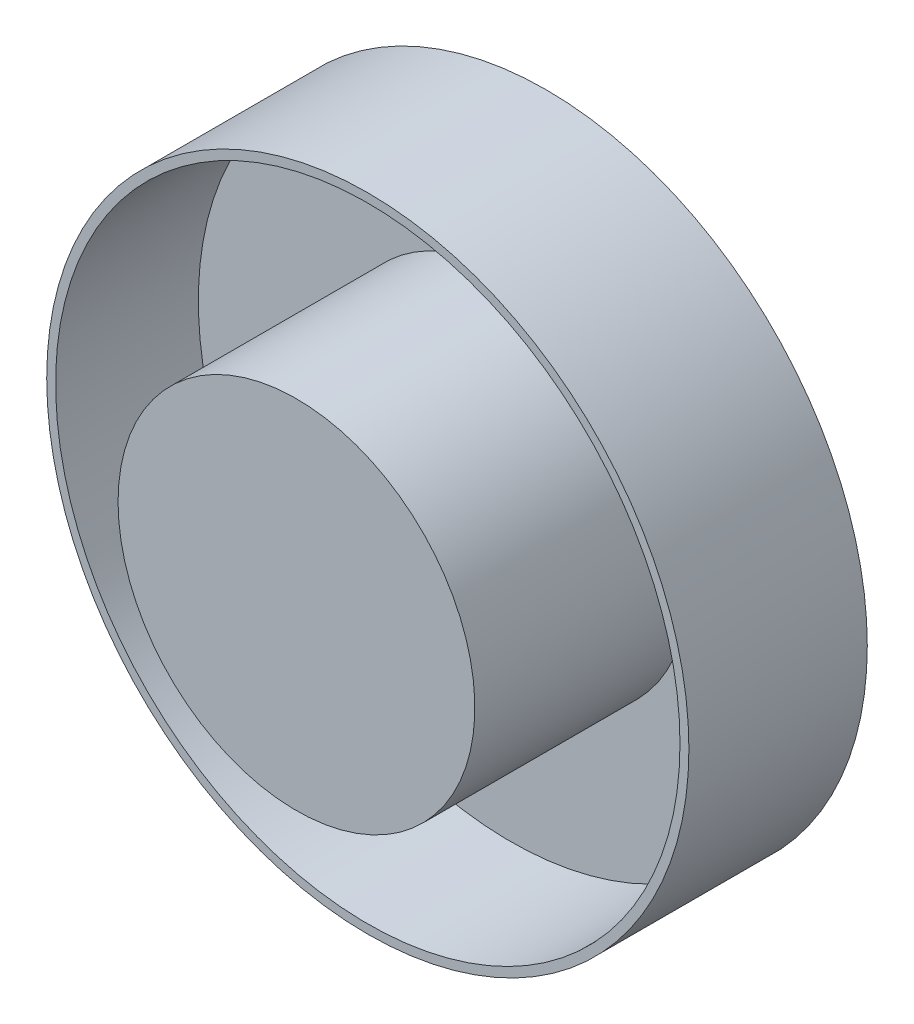
ISO-10303-21;
HEADER;
FILE_DESCRIPTION(('STEP AP214'),'2;1');
FILE_NAME('part.step','',(''),(''),'','','');
FILE_SCHEMA(('AUTOMOTIVE_DESIGN { 1 0 10303 214 1 1 1 1 }'));
ENDSEC;
DATA;
#1=APPLICATION_CONTEXT('core data for automotive mechanical design processes');
#2=APPLICATION_PROTOCOL_DEFINITION('international standard','automotive_design',2000,#1);
#3=PRODUCT_CONTEXT('',#1,'mechanical');
#4=PRODUCT('Part','Part','',(#3));
#5=PRODUCT_RELATED_PRODUCT_CATEGORY('part','',(#4));
#6=PRODUCT_DEFINITION_FORMATION('','',#4);
#7=PRODUCT_DEFINITION_CONTEXT('part definition',#1,'design');
#8=PRODUCT_DEFINITION('design','',#6,#7);
#9=PRODUCT_DEFINITION_SHAPE('','',#8);
#10=(LENGTH_UNIT() NAMED_UNIT(*) SI_UNIT(.MILLI.,.METRE.));
#11=(NAMED_UNIT(*) PLANE_ANGLE_UNIT() SI_UNIT($,.RADIAN.));
#12=(NAMED_UNIT(*) SI_UNIT($,.STERADIAN.) SOLID_ANGLE_UNIT());
#13=UNCERTAINTY_MEASURE_WITH_UNIT(LENGTH_MEASURE(1.E-05),#10,'distance_accuracy_value','');
#14=(GEOMETRIC_REPRESENTATION_CONTEXT(3) GLOBAL_UNCERTAINTY_ASSIGNED_CONTEXT((#13)) GLOBAL_UNIT_ASSIGNED_CONTEXT((#10,
#11,#12)) REPRESENTATION_CONTEXT('',''));
#15=CARTESIAN_POINT('',(0.,0.,0.));
#16=DIRECTION('',(0.,0.,1.));
#17=DIRECTION('',(1.,0.,0.));
#18=AXIS2_PLACEMENT_3D('',#15,#16,#17);
#19=CARTESIAN_POINT('',(0.,0.,12.7));
#20=DIRECTION('',(0.,0.,-1.));
#21=DIRECTION('',(-1.,0.,0.));
#22=AXIS2_PLACEMENT_3D('',#19,#20,#21);
#23=CYLINDRICAL_SURFACE('',#22,22.86);
#24=CARTESIAN_POINT('',(0.,0.,12.7));
#25=DIRECTION('',(0.,0.,1.));
#26=DIRECTION('',(1.,0.,0.));
#27=AXIS2_PLACEMENT_3D('',#24,#25,#26);
#28=CIRCLE('',#27,22.86);
#29=CARTESIAN_POINT('',(22.86,0.,12.7));
#30=VERTEX_POINT('',#29);
#31=EDGE_CURVE('E10',#30,#30,#28,.T.);
#32=ORIENTED_EDGE('',*,*,#31,.F.);
#33=EDGE_LOOP('',(#32));
#34=FACE_BOUND('',#33,.T.);
#35=CARTESIAN_POINT('',(0.,0.,0.));
#36=DIRECTION('',(0.,0.,1.));
#37=DIRECTION('',(1.,0.,0.));
#38=AXIS2_PLACEMENT_3D('',#35,#36,#37);
#39=CIRCLE('',#38,22.86);
#40=CARTESIAN_POINT('',(22.86,0.,0.));
#41=VERTEX_POINT('',#40);
#42=EDGE_CURVE('E37',#41,#41,#39,.T.);
#43=ORIENTED_EDGE('',*,*,#42,.T.);
#44=EDGE_LOOP('',(#43));
#45=FACE_BOUND('',#44,.T.);
#46=ADVANCED_FACE('F34',(#34,#45),#23,.T.);
#47=CARTESIAN_POINT('',(0.,0.,12.7));
#48=DIRECTION('',(0.,0.,1.));
#49=DIRECTION('',(1.,0.,0.));
#50=AXIS2_PLACEMENT_3D('',#47,#48,#49);
#51=PLANE('',#50);
#52=CARTESIAN_POINT('',(0.,0.,12.7));
#53=DIRECTION('',(0.,0.,1.));
#54=DIRECTION('',(1.,0.,0.));
#55=AXIS2_PLACEMENT_3D('',#52,#53,#54);
#56=CIRCLE('',#55,22.225);
#57=CARTESIAN_POINT('',(22.225,0.,12.7));
#58=VERTEX_POINT('',#57);
#59=EDGE_CURVE('E46',#58,#58,#56,.T.);
#60=ORIENTED_EDGE('',*,*,#59,.F.);
#61=EDGE_LOOP('',(#60));
#62=FACE_BOUND('',#61,.T.);
#63=ORIENTED_EDGE('',*,*,#31,.T.);
#64=EDGE_LOOP('',(#63));
#65=FACE_BOUND('',#64,.T.);
#66=ADVANCED_FACE('F79',(#62,#65),#51,.T.);
#67=CARTESIAN_POINT('',(0.,0.,0.));
#68=DIRECTION('',(0.,0.,1.));
#69=DIRECTION('',(1.,0.,0.));
#70=AXIS2_PLACEMENT_3D('',#67,#68,#69);
#71=PLANE('',#70);
#72=ORIENTED_EDGE('',*,*,#42,.F.);
#73=EDGE_LOOP('',(#72));
#74=FACE_BOUND('',#73,.T.);
#75=ADVANCED_FACE('F75',(#74),#71,.F.);
#76=CARTESIAN_POINT('',(0.,0.,2.54));
#77=DIRECTION('',(0.,0.,1.));
#78=DIRECTION('',(1.,0.,0.));
#79=AXIS2_PLACEMENT_3D('',#76,#77,#78);
#80=CYLINDRICAL_SURFACE('',#79,22.225);
#81=CARTESIAN_POINT('',(0.,0.,2.54));
#82=DIRECTION('',(0.,0.,1.));
#83=DIRECTION('',(1.,0.,0.));
#84=AXIS2_PLACEMENT_3D('',#81,#82,#83);
#85=CIRCLE('',#84,22.225);
#86=CARTESIAN_POINT('',(22.225,0.,2.54));
#87=VERTEX_POINT('',#86);
#88=EDGE_CURVE('E44',#87,#87,#85,.T.);
#89=ORIENTED_EDGE('',*,*,#88,.F.);
#90=EDGE_LOOP('',(#89));
#91=FACE_BOUND('',#90,.T.);
#92=ORIENTED_EDGE('',*,*,#59,.T.);
#93=EDGE_LOOP('',(#92));
#94=FACE_BOUND('',#93,.T.);
#95=ADVANCED_FACE('F69',(#91,#94),#80,.F.);
#96=CARTESIAN_POINT('',(0.,0.,2.54));
#97=DIRECTION('',(0.,0.,1.));
#98=DIRECTION('',(1.,0.,0.));
#99=AXIS2_PLACEMENT_3D('',#96,#97,#98);
#100=PLANE('',#99);
#101=CARTESIAN_POINT('',(0.,0.,2.54));
#102=DIRECTION('',(0.,0.,1.));
#103=DIRECTION('',(1.,0.,0.));
#104=AXIS2_PLACEMENT_3D('',#101,#102,#103);
#105=CIRCLE('',#104,12.7);
#106=CARTESIAN_POINT('',(-12.7,0.,2.54));
#107=VERTEX_POINT('',#106);
#108=EDGE_CURVE('E52',#107,#107,#105,.T.);
#109=ORIENTED_EDGE('',*,*,#108,.F.);
#110=EDGE_LOOP('',(#109));
#111=FACE_BOUND('',#110,.T.);
#112=ORIENTED_EDGE('',*,*,#88,.T.);
#113=EDGE_LOOP('',(#112));
#114=FACE_BOUND('',#113,.T.);
#115=ADVANCED_FACE('F63',(#111,#114),#100,.T.);
#116=CARTESIAN_POINT('',(0.,0.,17.78));
#117=DIRECTION('',(0.,0.,-1.));
#118=DIRECTION('',(-1.,0.,0.));
#119=AXIS2_PLACEMENT_3D('',#116,#117,#118);
#120=CYLINDRICAL_SURFACE('',#119,12.7);
#121=CARTESIAN_POINT('',(0.,0.,17.78));
#122=DIRECTION('',(0.,0.,1.));
#123=DIRECTION('',(1.,0.,0.));
#124=AXIS2_PLACEMENT_3D('',#121,#122,#123);
#125=CIRCLE('',#124,12.7);
#126=CARTESIAN_POINT('',(-12.7,0.,17.78));
#127=VERTEX_POINT('',#126);
#128=EDGE_CURVE('E49',#127,#127,#125,.T.);
#129=CARTESIAN_POINT('',(-12.7,0.,17.78));
#130=CARTESIAN_POINT('',(-12.7,0.,17.62125));
#131=CARTESIAN_POINT('',(-12.7,0.,17.4625));
#132=CARTESIAN_POINT('',(-12.7,0.,17.145));
#133=CARTESIAN_POINT('',(-12.7,0.,16.98625));
#134=CARTESIAN_POINT('',(-12.7,0.,16.66875));
#135=CARTESIAN_POINT('',(-12.7,0.,16.51));
#136=CARTESIAN_POINT('',(-12.7,0.,16.1925));
#137=CARTESIAN_POINT('',(-12.7,0.,16.03375));
#138=CARTESIAN_POINT('',(-12.7,0.,15.71625));
#139=CARTESIAN_POINT('',(-12.7,0.,15.5575));
#140=CARTESIAN_POINT('',(-12.7,0.,15.24));
#141=CARTESIAN_POINT('',(-12.7,0.,15.08125));
#142=CARTESIAN_POINT('',(-12.7,0.,14.76375));
#143=CARTESIAN_POINT('',(-12.7,0.,14.605));
#144=CARTESIAN_POINT('',(-12.7,0.,14.2875));
#145=CARTESIAN_POINT('',(-12.7,0.,14.12875));
#146=CARTESIAN_POINT('',(-12.7,0.,13.81125));
#147=CARTESIAN_POINT('',(-12.7,0.,13.6525));
#148=CARTESIAN_POINT('',(-12.7,0.,13.335));
#149=CARTESIAN_POINT('',(-12.7,0.,13.17625));
#150=CARTESIAN_POINT('',(-12.7,0.,12.85875));
#151=CARTESIAN_POINT('',(-12.7,0.,12.7));
#152=CARTESIAN_POINT('',(-12.7,0.,12.3825));
#153=CARTESIAN_POINT('',(-12.7,0.,12.22375));
#154=CARTESIAN_POINT('',(-12.7,0.,11.90625));
#155=CARTESIAN_POINT('',(-12.7,0.,11.7475));
#156=CARTESIAN_POINT('',(-12.7,0.,11.43));
#157=CARTESIAN_POINT('',(-12.7,0.,11.27125));
#158=CARTESIAN_POINT('',(-12.7,0.,10.95375));
#159=CARTESIAN_POINT('',(-12.7,0.,10.795));
#160=CARTESIAN_POINT('',(-12.7,0.,10.4775));
#161=CARTESIAN_POINT('',(-12.7,0.,10.31875));
#162=CARTESIAN_POINT('',(-12.7,0.,10.00125));
#163=CARTESIAN_POINT('',(-12.7,0.,9.8425));
#164=CARTESIAN_POINT('',(-12.7,0.,9.525));
#165=CARTESIAN_POINT('',(-12.7,0.,9.36625));
#166=CARTESIAN_POINT('',(-12.7,0.,9.04875));
#167=CARTESIAN_POINT('',(-12.7,0.,8.89));
#168=CARTESIAN_POINT('',(-12.7,0.,8.5725));
#169=CARTESIAN_POINT('',(-12.7,0.,8.41375));
#170=CARTESIAN_POINT('',(-12.7,0.,8.09625));
#171=CARTESIAN_POINT('',(-12.7,0.,7.9375));
#172=CARTESIAN_POINT('',(-12.7,0.,7.62));
#173=CARTESIAN_POINT('',(-12.7,0.,7.46125));
#174=CARTESIAN_POINT('',(-12.7,0.,7.14375));
#175=CARTESIAN_POINT('',(-12.7,0.,6.985));
#176=CARTESIAN_POINT('',(-12.7,0.,6.6675));
#177=CARTESIAN_POINT('',(-12.7,0.,6.50875));
#178=CARTESIAN_POINT('',(-12.7,0.,6.19125));
#179=CARTESIAN_POINT('',(-12.7,0.,6.0325));
#180=CARTESIAN_POINT('',(-12.7,0.,5.715));
#181=CARTESIAN_POINT('',(-12.7,0.,5.55625));
#182=CARTESIAN_POINT('',(-12.7,0.,5.23875));
#183=CARTESIAN_POINT('',(-12.7,0.,5.08));
#184=CARTESIAN_POINT('',(-12.7,0.,4.7625));
#185=CARTESIAN_POINT('',(-12.7,0.,4.60375));
#186=CARTESIAN_POINT('',(-12.7,0.,4.28625));
#187=CARTESIAN_POINT('',(-12.7,0.,4.1275));
#188=CARTESIAN_POINT('',(-12.7,0.,3.81));
#189=CARTESIAN_POINT('',(-12.7,0.,3.65125));
#190=CARTESIAN_POINT('',(-12.7,0.,3.33375));
#191=CARTESIAN_POINT('',(-12.7,0.,3.175));
#192=CARTESIAN_POINT('',(-12.7,0.,2.8575));
#193=CARTESIAN_POINT('',(-12.7,0.,2.69875));
#194=CARTESIAN_POINT('',(-12.7,0.,2.54));
#195=B_SPLINE_CURVE_WITH_KNOTS('',3,(#129,#130,#131,#132,#133,#134,#135,#136,#137,#138,#139,
#140,#141,#142,#143,#144,#145,#146,#147,#148,#149,#150,#151,#152,#153,#154,#155,#156,#157,#158,
#159,#160,#161,#162,#163,#164,#165,#166,#167,#168,#169,#170,#171,#172,#173,#174,#175,#176,#177,
#178,#179,#180,#181,#182,#183,#184,#185,#186,#187,#188,#189,#190,#191,#192,#193,#194),
.UNSPECIFIED.,.F.,.F.,(4,2,2,2,2,2,2,2,2,2,2,2,2,2,2,2,2,2,2,2,2,2,2,2,2,2,2,2,2,2,2,2,4),(0.,
0.476249999999998,0.952499999999998,1.42875,1.905,2.38125,2.8575,3.33375,3.81,4.28625,4.7625,
5.23875,5.715,6.19125,6.6675,7.14375,7.62,8.09625,8.57249999999999,9.04875,9.525,10.00125,
10.4775,10.95375,11.43,11.90625,12.3825,12.85875,13.335,13.81125,14.2875,14.76375,15.24),.UNSPECIFIED.);
#196=EDGE_CURVE('BSEAM60',#127,#107,#195,.T.);
#197=ORIENTED_EDGE('',*,*,#128,.F.);
#198=ORIENTED_EDGE('',*,*,#108,.T.);
#199=ORIENTED_EDGE('',*,*,#196,.T.);
#200=ORIENTED_EDGE('',*,*,#196,.F.);
#201=EDGE_LOOP('',(#197,#199,#198,#200));
#202=FACE_BOUND('',#201,.T.);
#203=ADVANCED_FACE('F60',(#202),#120,.T.);
#204=CARTESIAN_POINT('',(0.,0.,17.78));
#205=DIRECTION('',(0.,0.,1.));
#206=DIRECTION('',(1.,0.,0.));
#207=AXIS2_PLACEMENT_3D('',#204,#205,#206);
#208=PLANE('',#207);
#209=ORIENTED_EDGE('',*,*,#128,.T.);
#210=EDGE_LOOP('',(#209));
#211=FACE_BOUND('',#210,.T.);
#212=ADVANCED_FACE('F58',(#211),#208,.T.);
#213=CLOSED_SHELL('',(#46,#66,#75,#95,#115,#203,#212));
#214=MANIFOLD_SOLID_BREP('B2',#213);
#215=ADVANCED_BREP_SHAPE_REPRESENTATION('',(#18,#214),#14);
#216=SHAPE_DEFINITION_REPRESENTATION(#9,#215);
ENDSEC;
END-ISO-10303-21;
